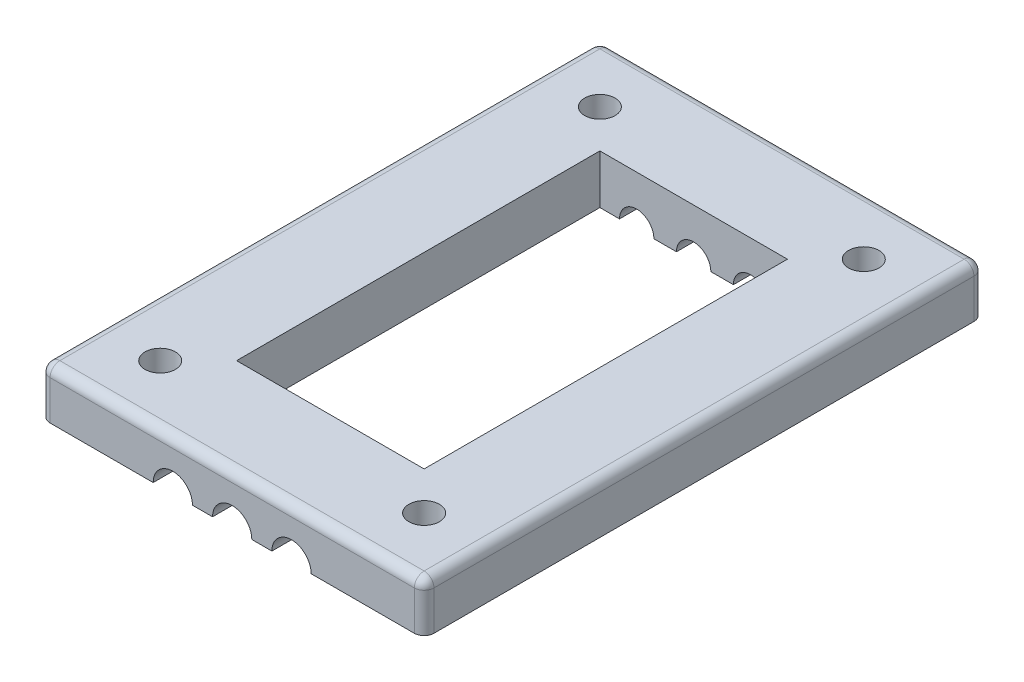
ISO-10303-21;
HEADER;
FILE_DESCRIPTION(('STEP AP214'),'2;1');
FILE_NAME('part.step','',(''),(''),'','','');
FILE_SCHEMA(('AUTOMOTIVE_DESIGN { 1 0 10303 214 1 1 1 1 }'));
ENDSEC;
DATA;
#1=APPLICATION_CONTEXT('core data for automotive mechanical design processes');
#2=APPLICATION_PROTOCOL_DEFINITION('international standard','automotive_design',2000,#1);
#3=PRODUCT_CONTEXT('',#1,'mechanical');
#4=PRODUCT('Part','Part','',(#3));
#5=PRODUCT_RELATED_PRODUCT_CATEGORY('part','',(#4));
#6=PRODUCT_DEFINITION_FORMATION('','',#4);
#7=PRODUCT_DEFINITION_CONTEXT('part definition',#1,'design');
#8=PRODUCT_DEFINITION('design','',#6,#7);
#9=PRODUCT_DEFINITION_SHAPE('','',#8);
#10=(LENGTH_UNIT() NAMED_UNIT(*) SI_UNIT(.MILLI.,.METRE.));
#11=(NAMED_UNIT(*) PLANE_ANGLE_UNIT() SI_UNIT($,.RADIAN.));
#12=(NAMED_UNIT(*) SI_UNIT($,.STERADIAN.) SOLID_ANGLE_UNIT());
#13=UNCERTAINTY_MEASURE_WITH_UNIT(LENGTH_MEASURE(1.E-05),#10,'distance_accuracy_value','');
#14=(GEOMETRIC_REPRESENTATION_CONTEXT(3) GLOBAL_UNCERTAINTY_ASSIGNED_CONTEXT((#13)) GLOBAL_UNIT_ASSIGNED_CONTEXT((#10,
#11,#12)) REPRESENTATION_CONTEXT('',''));
#15=CARTESIAN_POINT('',(0.,0.,0.));
#16=DIRECTION('',(0.,0.,1.));
#17=DIRECTION('',(1.,0.,0.));
#18=AXIS2_PLACEMENT_3D('',#15,#16,#17);
#19=CARTESIAN_POINT('',(19.55,20.1031353824411,-54.3715932879716));
#20=DIRECTION('',(0.,-1.,0.));
#21=DIRECTION('',(1.,0.,0.));
#22=AXIS2_PLACEMENT_3D('',#19,#20,#21);
#23=PLANE('',#22);
#24=DIRECTION('',(1.,0.,0.));
#25=VECTOR('',#24,1.);
#26=CARTESIAN_POINT('',(-9.55,20.1031353824411,-28.5));
#27=LINE('',#26,#25);
#28=CARTESIAN_POINT('',(-4.04999999999999,20.1031353824411,-28.5));
#29=VERTEX_POINT('',#28);
#30=CARTESIAN_POINT('',(-1.75,20.1031353824411,-28.5));
#31=VERTEX_POINT('',#30);
#32=EDGE_CURVE('E412',#29,#31,#27,.T.);
#33=ORIENTED_EDGE('',*,*,#32,.F.);
#34=DIRECTION('',(0.,0.,1.));
#35=VECTOR('',#34,1.);
#36=CARTESIAN_POINT('',(-4.04999999999999,20.1031353824411,-38.501));
#37=LINE('',#36,#35);
#38=CARTESIAN_POINT('',(-4.04999999999999,20.1031353824411,-38.5));
#39=VERTEX_POINT('',#38);
#40=EDGE_CURVE('E428',#29,#39,#37,.F.);
#41=ORIENTED_EDGE('',*,*,#40,.T.);
#42=DIRECTION('',(-1.,0.,0.));
#43=VECTOR('',#42,1.);
#44=CARTESIAN_POINT('',(0.,20.1031353824411,-38.5));
#45=LINE('',#44,#43);
#46=CARTESIAN_POINT('',(-1.75,20.1031353824411,-38.5));
#47=VERTEX_POINT('',#46);
#48=EDGE_CURVE('E504',#47,#39,#45,.T.);
#49=ORIENTED_EDGE('',*,*,#48,.F.);
#50=DIRECTION('',(0.,0.,1.));
#51=VECTOR('',#50,1.);
#52=CARTESIAN_POINT('',(-1.75,20.1031353824411,-38.501));
#53=LINE('',#52,#51);
#54=EDGE_CURVE('E437',#47,#31,#53,.T.);
#55=ORIENTED_EDGE('',*,*,#54,.T.);
#56=EDGE_LOOP('',(#33,#41,#49,#55));
#57=FACE_BOUND('',#56,.T.);
#58=ADVANCED_FACE('F41',(#57),#23,.T.);
#59=CARTESIAN_POINT('',(1.75000000000001,20.1031353824411,-28.5));
#60=VERTEX_POINT('',#59);
#61=CARTESIAN_POINT('',(4.05,20.1031353824411,-28.5));
#62=VERTEX_POINT('',#61);
#63=EDGE_CURVE('E515',#60,#62,#27,.T.);
#64=ORIENTED_EDGE('',*,*,#63,.F.);
#65=DIRECTION('',(0.,0.,1.));
#66=VECTOR('',#65,1.);
#67=CARTESIAN_POINT('',(1.75000000000001,20.1031353824411,-38.501));
#68=LINE('',#67,#66);
#69=CARTESIAN_POINT('',(1.75000000000001,20.1031353824411,-38.5));
#70=VERTEX_POINT('',#69);
#71=EDGE_CURVE('E434',#60,#70,#68,.F.);
#72=ORIENTED_EDGE('',*,*,#71,.T.);
#73=CARTESIAN_POINT('',(4.05,20.1031353824411,-38.5));
#74=VERTEX_POINT('',#73);
#75=EDGE_CURVE('E419',#74,#70,#45,.T.);
#76=ORIENTED_EDGE('',*,*,#75,.F.);
#77=DIRECTION('',(0.,0.,1.));
#78=VECTOR('',#77,1.);
#79=CARTESIAN_POINT('',(4.05,20.1031353824411,-38.501));
#80=LINE('',#79,#78);
#81=EDGE_CURVE('E443',#74,#62,#80,.T.);
#82=ORIENTED_EDGE('',*,*,#81,.T.);
#83=EDGE_LOOP('',(#64,#72,#76,#82));
#84=FACE_BOUND('',#83,.T.);
#85=ADVANCED_FACE('F513',(#84),#23,.T.);
#86=DIRECTION('',(-1.,0.,0.));
#87=VECTOR('',#86,1.);
#88=CARTESIAN_POINT('',(0.,20.1031353824411,18.5));
#89=LINE('',#88,#87);
#90=CARTESIAN_POINT('',(4.045,20.1031353824411,18.5));
#91=VERTEX_POINT('',#90);
#92=CARTESIAN_POINT('',(2.00000000000001,20.1031353824411,18.5));
#93=VERTEX_POINT('',#92);
#94=EDGE_CURVE('E458',#91,#93,#89,.T.);
#95=ORIENTED_EDGE('',*,*,#94,.T.);
#96=DIRECTION('',(0.,0.,-1.));
#97=VECTOR('',#96,1.);
#98=CARTESIAN_POINT('',(2.00000000000001,20.1031353824411,18.501));
#99=LINE('',#98,#97);
#100=CARTESIAN_POINT('',(2.00000000000001,20.1031353824411,8.5));
#101=VERTEX_POINT('',#100);
#102=EDGE_CURVE('E449',#93,#101,#99,.T.);
#103=ORIENTED_EDGE('',*,*,#102,.T.);
#104=DIRECTION('',(-1.,0.,0.));
#105=VECTOR('',#104,1.);
#106=CARTESIAN_POINT('',(-9.55,20.1031353824411,8.5));
#107=LINE('',#106,#105);
#108=CARTESIAN_POINT('',(4.045,20.1031353824411,8.5));
#109=VERTEX_POINT('',#108);
#110=EDGE_CURVE('E406',#109,#101,#107,.T.);
#111=ORIENTED_EDGE('',*,*,#110,.F.);
#112=DIRECTION('',(0.,0.,-1.));
#113=VECTOR('',#112,1.);
#114=CARTESIAN_POINT('',(4.045,20.1031353824411,18.501));
#115=LINE('',#114,#113);
#116=EDGE_CURVE('E249',#109,#91,#115,.F.);
#117=ORIENTED_EDGE('',*,*,#116,.T.);
#118=EDGE_LOOP('',(#95,#103,#111,#117));
#119=FACE_BOUND('',#118,.T.);
#120=ADVANCED_FACE('F456',(#119),#23,.T.);
#121=CARTESIAN_POINT('',(18.55,20.1031353824411,-38.5));
#122=VERTEX_POINT('',#121);
#123=CARTESIAN_POINT('',(7.55000000000001,20.1031353824411,-38.5));
#124=VERTEX_POINT('',#123);
#125=EDGE_CURVE('E417',#122,#124,#45,.T.);
#126=ORIENTED_EDGE('',*,*,#125,.F.);
#127=CARTESIAN_POINT('',(18.55,20.1031353824411,-37.5));
#128=DIRECTION('',(0.,-1.,0.));
#129=DIRECTION('',(1.,0.,0.));
#130=AXIS2_PLACEMENT_3D('',#127,#128,#129);
#131=CIRCLE('',#130,1.);
#132=CARTESIAN_POINT('',(19.55,20.1031353824411,-37.5));
#133=VERTEX_POINT('',#132);
#134=EDGE_CURVE('E64',#122,#133,#131,.T.);
#135=ORIENTED_EDGE('',*,*,#134,.T.);
#136=DIRECTION('',(0.,0.,-1.));
#137=VECTOR('',#136,1.);
#138=CARTESIAN_POINT('',(19.55,20.1031353824411,0.));
#139=LINE('',#138,#137);
#140=CARTESIAN_POINT('',(19.55,20.1031353824411,17.5));
#141=VERTEX_POINT('',#140);
#142=EDGE_CURVE('E420',#141,#133,#139,.T.);
#143=ORIENTED_EDGE('',*,*,#142,.F.);
#144=CARTESIAN_POINT('',(18.55,20.1031353824411,17.5));
#145=DIRECTION('',(0.,-1.,0.));
#146=DIRECTION('',(1.,0.,0.));
#147=AXIS2_PLACEMENT_3D('',#144,#145,#146);
#148=CIRCLE('',#147,1.);
#149=CARTESIAN_POINT('',(18.55,20.1031353824411,18.5));
#150=VERTEX_POINT('',#149);
#151=EDGE_CURVE('E58',#141,#150,#148,.T.);
#152=ORIENTED_EDGE('',*,*,#151,.T.);
#153=CARTESIAN_POINT('',(8.04500000000001,20.1031353824411,18.5));
#154=VERTEX_POINT('',#153);
#155=EDGE_CURVE('E424',#150,#154,#89,.T.);
#156=ORIENTED_EDGE('',*,*,#155,.T.);
#157=DIRECTION('',(0.,0.,-1.));
#158=VECTOR('',#157,1.);
#159=CARTESIAN_POINT('',(8.04500000000001,20.1031353824411,18.501));
#160=LINE('',#159,#158);
#161=CARTESIAN_POINT('',(8.04500000000001,20.1031353824411,8.5));
#162=VERTEX_POINT('',#161);
#163=EDGE_CURVE('E245',#154,#162,#160,.T.);
#164=ORIENTED_EDGE('',*,*,#163,.T.);
#165=CARTESIAN_POINT('',(9.55,20.1031353824411,8.5));
#166=VERTEX_POINT('',#165);
#167=EDGE_CURVE('E242',#166,#162,#107,.T.);
#168=ORIENTED_EDGE('',*,*,#167,.F.);
#169=DIRECTION('',(0.,0.,1.));
#170=VECTOR('',#169,1.);
#171=CARTESIAN_POINT('',(9.55,20.1031353824411,-28.5));
#172=LINE('',#171,#170);
#173=CARTESIAN_POINT('',(9.55,20.1031353824411,-28.5));
#174=VERTEX_POINT('',#173);
#175=EDGE_CURVE('E413',#174,#166,#172,.T.);
#176=ORIENTED_EDGE('',*,*,#175,.F.);
#177=CARTESIAN_POINT('',(7.55000000000001,20.1031353824411,-28.5));
#178=VERTEX_POINT('',#177);
#179=EDGE_CURVE('E408',#178,#174,#27,.T.);
#180=ORIENTED_EDGE('',*,*,#179,.F.);
#181=DIRECTION('',(0.,0.,1.));
#182=VECTOR('',#181,1.);
#183=CARTESIAN_POINT('',(7.55000000000001,20.1031353824411,-38.501));
#184=LINE('',#183,#182);
#185=EDGE_CURVE('E440',#178,#124,#184,.F.);
#186=ORIENTED_EDGE('',*,*,#185,.T.);
#187=EDGE_LOOP('',(#126,#135,#143,#152,#156,#164,#168,#176,#180,#186));
#188=FACE_BOUND('',#187,.T.);
#189=CARTESIAN_POINT('',(13.439087296526,20.1031353824411,-32.389087296526));
#190=DIRECTION('',(0.,-1.,0.));
#191=DIRECTION('',(1.,0.,0.));
#192=AXIS2_PLACEMENT_3D('',#189,#190,#191);
#193=CIRCLE('',#192,1.54999999999999);
#194=CARTESIAN_POINT('',(14.989087296526,20.1031353824411,-32.389087296526));
#195=VERTEX_POINT('',#194);
#196=EDGE_CURVE('E361',#195,#195,#193,.T.);
#197=ORIENTED_EDGE('',*,*,#196,.F.);
#198=EDGE_LOOP('',(#197));
#199=FACE_BOUND('',#198,.T.);
#200=CARTESIAN_POINT('',(13.439087296526,20.1031353824411,12.389087296526));
#201=DIRECTION('',(0.,-1.,0.));
#202=DIRECTION('',(1.,0.,0.));
#203=AXIS2_PLACEMENT_3D('',#200,#201,#202);
#204=CIRCLE('',#203,1.55);
#205=CARTESIAN_POINT('',(14.989087296526,20.1031353824411,12.389087296526));
#206=VERTEX_POINT('',#205);
#207=EDGE_CURVE('E400',#206,#206,#204,.T.);
#208=ORIENTED_EDGE('',*,*,#207,.F.);
#209=EDGE_LOOP('',(#208));
#210=FACE_BOUND('',#209,.T.);
#211=ADVANCED_FACE('F543',(#188,#199,#210),#23,.T.);
#212=DIRECTION('',(0.,0.,-1.));
#213=VECTOR('',#212,1.);
#214=CARTESIAN_POINT('',(-19.55,20.1031353824411,0.));
#215=LINE('',#214,#213);
#216=CARTESIAN_POINT('',(-19.55,20.1031353824411,17.5));
#217=VERTEX_POINT('',#216);
#218=CARTESIAN_POINT('',(-19.55,20.1031353824411,-37.5));
#219=VERTEX_POINT('',#218);
#220=EDGE_CURVE('E422',#217,#219,#215,.T.);
#221=ORIENTED_EDGE('',*,*,#220,.T.);
#222=CARTESIAN_POINT('',(-18.55,20.1031353824411,-37.5));
#223=DIRECTION('',(0.,-1.,0.));
#224=DIRECTION('',(1.,0.,0.));
#225=AXIS2_PLACEMENT_3D('',#222,#223,#224);
#226=CIRCLE('',#225,1.);
#227=CARTESIAN_POINT('',(-18.55,20.1031353824411,-38.5));
#228=VERTEX_POINT('',#227);
#229=EDGE_CURVE('E314',#219,#228,#226,.T.);
#230=ORIENTED_EDGE('',*,*,#229,.T.);
#231=CARTESIAN_POINT('',(-7.55,20.1031353824411,-38.5));
#232=VERTEX_POINT('',#231);
#233=EDGE_CURVE('E416',#232,#228,#45,.T.);
#234=ORIENTED_EDGE('',*,*,#233,.F.);
#235=DIRECTION('',(0.,0.,1.));
#236=VECTOR('',#235,1.);
#237=CARTESIAN_POINT('',(-7.55,20.1031353824411,-38.501));
#238=LINE('',#237,#236);
#239=CARTESIAN_POINT('',(-7.55,20.1031353824411,-28.5));
#240=VERTEX_POINT('',#239);
#241=EDGE_CURVE('E431',#232,#240,#238,.T.);
#242=ORIENTED_EDGE('',*,*,#241,.T.);
#243=CARTESIAN_POINT('',(-9.55,20.1031353824411,-28.5));
#244=VERTEX_POINT('',#243);
#245=EDGE_CURVE('E409',#244,#240,#27,.T.);
#246=ORIENTED_EDGE('',*,*,#245,.F.);
#247=DIRECTION('',(0.,0.,-1.));
#248=VECTOR('',#247,1.);
#249=CARTESIAN_POINT('',(-9.55,20.1031353824411,-28.5));
#250=LINE('',#249,#248);
#251=CARTESIAN_POINT('',(-9.55,20.1031353824411,8.5));
#252=VERTEX_POINT('',#251);
#253=EDGE_CURVE('E238',#252,#244,#250,.T.);
#254=ORIENTED_EDGE('',*,*,#253,.F.);
#255=CARTESIAN_POINT('',(-8.045,20.1031353824411,8.5));
#256=VERTEX_POINT('',#255);
#257=EDGE_CURVE('E219',#256,#252,#107,.T.);
#258=ORIENTED_EDGE('',*,*,#257,.F.);
#259=DIRECTION('',(0.,0.,-1.));
#260=VECTOR('',#259,1.);
#261=CARTESIAN_POINT('',(-8.045,20.1031353824411,18.501));
#262=LINE('',#261,#260);
#263=CARTESIAN_POINT('',(-8.045,20.1031353824411,18.5));
#264=VERTEX_POINT('',#263);
#265=EDGE_CURVE('E236',#256,#264,#262,.F.);
#266=ORIENTED_EDGE('',*,*,#265,.T.);
#267=CARTESIAN_POINT('',(-18.55,20.1031353824411,18.5));
#268=VERTEX_POINT('',#267);
#269=EDGE_CURVE('E425',#264,#268,#89,.T.);
#270=ORIENTED_EDGE('',*,*,#269,.T.);
#271=CARTESIAN_POINT('',(-18.55,20.1031353824411,17.5));
#272=DIRECTION('',(0.,-1.,0.));
#273=DIRECTION('',(1.,0.,0.));
#274=AXIS2_PLACEMENT_3D('',#271,#272,#273);
#275=CIRCLE('',#274,1.);
#276=EDGE_CURVE('E312',#268,#217,#275,.T.);
#277=ORIENTED_EDGE('',*,*,#276,.T.);
#278=EDGE_LOOP('',(#221,#230,#234,#242,#246,#254,#258,#266,#270,#277));
#279=FACE_BOUND('',#278,.T.);
#280=CARTESIAN_POINT('',(-13.439087296526,20.1031353824411,-32.389087296526));
#281=DIRECTION('',(0.,-1.,0.));
#282=DIRECTION('',(1.,0.,0.));
#283=AXIS2_PLACEMENT_3D('',#280,#281,#282);
#284=CIRCLE('',#283,1.54999999999999);
#285=CARTESIAN_POINT('',(-11.889087296526,20.1031353824411,-32.389087296526));
#286=VERTEX_POINT('',#285);
#287=EDGE_CURVE('E355',#286,#286,#284,.T.);
#288=ORIENTED_EDGE('',*,*,#287,.F.);
#289=EDGE_LOOP('',(#288));
#290=FACE_BOUND('',#289,.T.);
#291=CARTESIAN_POINT('',(-13.439087296526,20.1031353824411,12.389087296526));
#292=DIRECTION('',(0.,-1.,0.));
#293=DIRECTION('',(1.,0.,0.));
#294=AXIS2_PLACEMENT_3D('',#291,#292,#293);
#295=CIRCLE('',#294,1.55);
#296=CARTESIAN_POINT('',(-11.889087296526,20.1031353824411,12.389087296526));
#297=VERTEX_POINT('',#296);
#298=EDGE_CURVE('E240',#297,#297,#295,.T.);
#299=ORIENTED_EDGE('',*,*,#298,.F.);
#300=EDGE_LOOP('',(#299));
#301=FACE_BOUND('',#300,.T.);
#302=ADVANCED_FACE('F233',(#279,#290,#301),#23,.T.);
#303=CARTESIAN_POINT('',(-2.,20.1031353824411,8.5));
#304=VERTEX_POINT('',#303);
#305=CARTESIAN_POINT('',(-4.045,20.1031353824411,8.5));
#306=VERTEX_POINT('',#305);
#307=EDGE_CURVE('E222',#304,#306,#107,.T.);
#308=ORIENTED_EDGE('',*,*,#307,.F.);
#309=DIRECTION('',(0.,0.,-1.));
#310=VECTOR('',#309,1.);
#311=CARTESIAN_POINT('',(-2.,20.1031353824411,18.501));
#312=LINE('',#311,#310);
#313=CARTESIAN_POINT('',(-2.,20.1031353824411,18.5));
#314=VERTEX_POINT('',#313);
#315=EDGE_CURVE('E446',#304,#314,#312,.F.);
#316=ORIENTED_EDGE('',*,*,#315,.T.);
#317=CARTESIAN_POINT('',(-4.045,20.1031353824411,18.5));
#318=VERTEX_POINT('',#317);
#319=EDGE_CURVE('E427',#314,#318,#89,.T.);
#320=ORIENTED_EDGE('',*,*,#319,.T.);
#321=DIRECTION('',(0.,0.,-1.));
#322=VECTOR('',#321,1.);
#323=CARTESIAN_POINT('',(-4.045,20.1031353824411,18.501));
#324=LINE('',#323,#322);
#325=EDGE_CURVE('E246',#318,#306,#324,.T.);
#326=ORIENTED_EDGE('',*,*,#325,.T.);
#327=EDGE_LOOP('',(#308,#316,#320,#326));
#328=FACE_BOUND('',#327,.T.);
#329=ADVANCED_FACE('F470',(#328),#23,.T.);
#330=CARTESIAN_POINT('',(-18.55,24.1031353824411,0.));
#331=DIRECTION('',(0.,0.,-1.));
#332=DIRECTION('',(-1.,0.,0.));
#333=AXIS2_PLACEMENT_3D('',#330,#331,#332);
#334=CYLINDRICAL_SURFACE('',#333,1.);
#335=DIRECTION('',(0.,0.,1.));
#336=VECTOR('',#335,1.);
#337=CARTESIAN_POINT('',(-18.55,25.1031353824411,18.5));
#338=LINE('',#337,#336);
#339=CARTESIAN_POINT('',(-18.55,25.1031353824411,-37.5));
#340=VERTEX_POINT('',#339);
#341=CARTESIAN_POINT('',(-18.55,25.1031353824411,17.5));
#342=VERTEX_POINT('',#341);
#343=EDGE_CURVE('E372',#340,#342,#338,.T.);
#344=ORIENTED_EDGE('',*,*,#343,.F.);
#345=CARTESIAN_POINT('',(-18.55,24.1031353824411,-37.5));
#346=DIRECTION('',(0.,0.,-1.));
#347=DIRECTION('',(-1.,0.,0.));
#348=AXIS2_PLACEMENT_3D('',#345,#346,#347);
#349=CIRCLE('',#348,1.);
#350=CARTESIAN_POINT('',(-19.55,24.1031353824411,-37.5));
#351=VERTEX_POINT('',#350);
#352=EDGE_CURVE('E297',#340,#351,#349,.F.);
#353=ORIENTED_EDGE('',*,*,#352,.T.);
#354=DIRECTION('',(0.,0.,1.));
#355=VECTOR('',#354,1.);
#356=CARTESIAN_POINT('',(-19.55,24.1031353824411,-38.5));
#357=LINE('',#356,#355);
#358=CARTESIAN_POINT('',(-19.55,24.1031353824411,17.5));
#359=VERTEX_POINT('',#358);
#360=EDGE_CURVE('E358',#359,#351,#357,.F.);
#361=ORIENTED_EDGE('',*,*,#360,.F.);
#362=CARTESIAN_POINT('',(-18.55,24.1031353824411,17.5));
#363=DIRECTION('',(0.,0.,-1.));
#364=DIRECTION('',(-1.,0.,0.));
#365=AXIS2_PLACEMENT_3D('',#362,#363,#364);
#366=CIRCLE('',#365,1.);
#367=EDGE_CURVE('E294',#359,#342,#366,.T.);
#368=ORIENTED_EDGE('',*,*,#367,.T.);
#369=EDGE_LOOP('',(#344,#353,#361,#368));
#370=FACE_BOUND('',#369,.T.);
#371=ADVANCED_FACE('F484',(#370),#334,.T.);
#372=CARTESIAN_POINT('',(0.,15.1031353824411,-38.5));
#373=DIRECTION('',(0.,0.,-1.));
#374=DIRECTION('',(-1.,0.,0.));
#375=AXIS2_PLACEMENT_3D('',#372,#373,#374);
#376=PLANE('',#375);
#377=ORIENTED_EDGE('',*,*,#233,.T.);
#378=DIRECTION('',(0.,-1.,0.));
#379=VECTOR('',#378,1.);
#380=CARTESIAN_POINT('',(-18.55,24.1031353824411,-38.5));
#381=LINE('',#380,#379);
#382=CARTESIAN_POINT('',(-18.55,24.1031353824411,-38.5));
#383=VERTEX_POINT('',#382);
#384=EDGE_CURVE('E318',#228,#383,#381,.F.);
#385=ORIENTED_EDGE('',*,*,#384,.T.);
#386=DIRECTION('',(-1.,0.,0.));
#387=VECTOR('',#386,1.);
#388=CARTESIAN_POINT('',(0.,24.1031353824411,-38.5));
#389=LINE('',#388,#387);
#390=CARTESIAN_POINT('',(18.55,24.1031353824411,-38.5));
#391=VERTEX_POINT('',#390);
#392=EDGE_CURVE('E366',#383,#391,#389,.F.);
#393=ORIENTED_EDGE('',*,*,#392,.T.);
#394=DIRECTION('',(0.,-1.,0.));
#395=VECTOR('',#394,1.);
#396=CARTESIAN_POINT('',(18.55,15.1031353824411,-38.5));
#397=LINE('',#396,#395);
#398=EDGE_CURVE('E316',#391,#122,#397,.T.);
#399=ORIENTED_EDGE('',*,*,#398,.T.);
#400=ORIENTED_EDGE('',*,*,#125,.T.);
#401=CARTESIAN_POINT('',(5.8,20.1031353824411,-38.5));
#402=DIRECTION('',(0.,0.,-1.));
#403=DIRECTION('',(-1.,0.,0.));
#404=AXIS2_PLACEMENT_3D('',#401,#402,#403);
#405=CIRCLE('',#404,1.75);
#406=EDGE_CURVE('E269',#124,#74,#405,.F.);
#407=ORIENTED_EDGE('',*,*,#406,.T.);
#408=ORIENTED_EDGE('',*,*,#75,.T.);
#409=CARTESIAN_POINT('',(0.,20.1031353824411,-38.5));
#410=DIRECTION('',(0.,0.,-1.));
#411=DIRECTION('',(-1.,0.,0.));
#412=AXIS2_PLACEMENT_3D('',#409,#410,#411);
#413=CIRCLE('',#412,1.75);
#414=EDGE_CURVE('E272',#70,#47,#413,.F.);
#415=ORIENTED_EDGE('',*,*,#414,.T.);
#416=ORIENTED_EDGE('',*,*,#48,.T.);
#417=CARTESIAN_POINT('',(-5.8,20.1031353824411,-38.5));
#418=DIRECTION('',(0.,0.,-1.));
#419=DIRECTION('',(-1.,0.,0.));
#420=AXIS2_PLACEMENT_3D('',#417,#418,#419);
#421=CIRCLE('',#420,1.75);
#422=EDGE_CURVE('E276',#39,#232,#421,.F.);
#423=ORIENTED_EDGE('',*,*,#422,.T.);
#424=EDGE_LOOP('',(#377,#385,#393,#399,#400,#407,#408,#415,#416,#423));
#425=FACE_BOUND('',#424,.T.);
#426=ADVANCED_FACE('F502',(#425),#376,.T.);
#427=CARTESIAN_POINT('',(0.,24.1031353824411,-37.5));
#428=DIRECTION('',(-1.,0.,0.));
#429=DIRECTION('',(0.,0.,1.));
#430=AXIS2_PLACEMENT_3D('',#427,#428,#429);
#431=CYLINDRICAL_SURFACE('',#430,1.);
#432=ORIENTED_EDGE('',*,*,#392,.F.);
#433=CARTESIAN_POINT('',(-18.55,24.1031353824411,-37.5));
#434=DIRECTION('',(-1.,0.,0.));
#435=DIRECTION('',(0.,0.,1.));
#436=AXIS2_PLACEMENT_3D('',#433,#434,#435);
#437=CIRCLE('',#436,1.);
#438=EDGE_CURVE('E291',#383,#340,#437,.F.);
#439=ORIENTED_EDGE('',*,*,#438,.T.);
#440=DIRECTION('',(-1.,0.,0.));
#441=VECTOR('',#440,1.);
#442=CARTESIAN_POINT('',(0.,25.1031353824411,-37.5));
#443=LINE('',#442,#441);
#444=CARTESIAN_POINT('',(18.55,25.1031353824411,-37.5));
#445=VERTEX_POINT('',#444);
#446=EDGE_CURVE('E369',#445,#340,#443,.T.);
#447=ORIENTED_EDGE('',*,*,#446,.F.);
#448=CARTESIAN_POINT('',(18.55,24.1031353824411,-37.5));
#449=DIRECTION('',(-1.,0.,0.));
#450=DIRECTION('',(0.,0.,1.));
#451=AXIS2_PLACEMENT_3D('',#448,#449,#450);
#452=CIRCLE('',#451,1.);
#453=EDGE_CURVE('E288',#445,#391,#452,.T.);
#454=ORIENTED_EDGE('',*,*,#453,.T.);
#455=EDGE_LOOP('',(#432,#439,#447,#454));
#456=FACE_BOUND('',#455,.T.);
#457=ADVANCED_FACE('F492',(#456),#431,.T.);
#458=CARTESIAN_POINT('',(-9.55,25.1031353824411,-28.5));
#459=DIRECTION('',(0.,0.,1.));
#460=DIRECTION('',(1.,0.,0.));
#461=AXIS2_PLACEMENT_3D('',#458,#459,#460);
#462=PLANE('',#461);
#463=DIRECTION('',(0.,-1.,0.));
#464=VECTOR('',#463,1.);
#465=CARTESIAN_POINT('',(-9.55,25.1031353824411,-28.5));
#466=LINE('',#465,#464);
#467=CARTESIAN_POINT('',(-9.55,25.1031353824411,-28.5));
#468=VERTEX_POINT('',#467);
#469=EDGE_CURVE('E258',#468,#244,#466,.T.);
#470=ORIENTED_EDGE('',*,*,#469,.T.);
#471=ORIENTED_EDGE('',*,*,#245,.T.);
#472=CARTESIAN_POINT('',(-5.8,20.1031353824411,-28.5));
#473=DIRECTION('',(0.,0.,1.));
#474=DIRECTION('',(1.,0.,0.));
#475=AXIS2_PLACEMENT_3D('',#472,#473,#474);
#476=CIRCLE('',#475,1.75);
#477=EDGE_CURVE('E278',#29,#240,#476,.T.);
#478=ORIENTED_EDGE('',*,*,#477,.F.);
#479=ORIENTED_EDGE('',*,*,#32,.T.);
#480=CARTESIAN_POINT('',(0.,20.1031353824411,-28.5));
#481=DIRECTION('',(0.,0.,1.));
#482=DIRECTION('',(1.,0.,0.));
#483=AXIS2_PLACEMENT_3D('',#480,#481,#482);
#484=CIRCLE('',#483,1.75);
#485=EDGE_CURVE('E274',#60,#31,#484,.T.);
#486=ORIENTED_EDGE('',*,*,#485,.F.);
#487=ORIENTED_EDGE('',*,*,#63,.T.);
#488=CARTESIAN_POINT('',(5.8,20.1031353824411,-28.5));
#489=DIRECTION('',(0.,0.,1.));
#490=DIRECTION('',(1.,0.,0.));
#491=AXIS2_PLACEMENT_3D('',#488,#489,#490);
#492=CIRCLE('',#491,1.75);
#493=EDGE_CURVE('E267',#178,#62,#492,.T.);
#494=ORIENTED_EDGE('',*,*,#493,.F.);
#495=ORIENTED_EDGE('',*,*,#179,.T.);
#496=DIRECTION('',(0.,-1.,0.));
#497=VECTOR('',#496,1.);
#498=CARTESIAN_POINT('',(9.55,25.1031353824411,-28.5));
#499=LINE('',#498,#497);
#500=CARTESIAN_POINT('',(9.55,25.1031353824411,-28.5));
#501=VERTEX_POINT('',#500);
#502=EDGE_CURVE('E255',#501,#174,#499,.T.);
#503=ORIENTED_EDGE('',*,*,#502,.F.);
#504=DIRECTION('',(-1.,0.,0.));
#505=VECTOR('',#504,1.);
#506=CARTESIAN_POINT('',(-9.55,25.1031353824411,-28.5));
#507=LINE('',#506,#505);
#508=EDGE_CURVE('E383',#501,#468,#507,.T.);
#509=ORIENTED_EDGE('',*,*,#508,.T.);
#510=EDGE_LOOP('',(#470,#471,#478,#479,#486,#487,#494,#495,#503,#509));
#511=FACE_BOUND('',#510,.T.);
#512=ADVANCED_FACE('F527',(#511),#462,.T.);
#513=CARTESIAN_POINT('',(5.8,20.1031353824411,-38.501));
#514=DIRECTION('',(0.,0.,1.));
#515=DIRECTION('',(1.,0.,0.));
#516=AXIS2_PLACEMENT_3D('',#513,#514,#515);
#517=CYLINDRICAL_SURFACE('',#516,1.75);
#518=ORIENTED_EDGE('',*,*,#185,.F.);
#519=ORIENTED_EDGE('',*,*,#493,.T.);
#520=ORIENTED_EDGE('',*,*,#81,.F.);
#521=ORIENTED_EDGE('',*,*,#406,.F.);
#522=EDGE_LOOP('',(#518,#519,#520,#521));
#523=FACE_BOUND('',#522,.T.);
#524=ADVANCED_FACE('F792',(#523),#517,.F.);
#525=CARTESIAN_POINT('',(0.,20.1031353824411,-38.501));
#526=DIRECTION('',(0.,0.,1.));
#527=DIRECTION('',(1.,0.,0.));
#528=AXIS2_PLACEMENT_3D('',#525,#526,#527);
#529=CYLINDRICAL_SURFACE('',#528,1.75);
#530=ORIENTED_EDGE('',*,*,#71,.F.);
#531=ORIENTED_EDGE('',*,*,#485,.T.);
#532=ORIENTED_EDGE('',*,*,#54,.F.);
#533=ORIENTED_EDGE('',*,*,#414,.F.);
#534=EDGE_LOOP('',(#530,#531,#532,#533));
#535=FACE_BOUND('',#534,.T.);
#536=ADVANCED_FACE('F517',(#535),#529,.F.);
#537=CARTESIAN_POINT('',(-5.8,20.1031353824411,-38.501));
#538=DIRECTION('',(0.,0.,1.));
#539=DIRECTION('',(1.,0.,0.));
#540=AXIS2_PLACEMENT_3D('',#537,#538,#539);
#541=CYLINDRICAL_SURFACE('',#540,1.75);
#542=ORIENTED_EDGE('',*,*,#40,.F.);
#543=ORIENTED_EDGE('',*,*,#477,.T.);
#544=ORIENTED_EDGE('',*,*,#241,.F.);
#545=ORIENTED_EDGE('',*,*,#422,.F.);
#546=EDGE_LOOP('',(#542,#543,#544,#545));
#547=FACE_BOUND('',#546,.T.);
#548=ADVANCED_FACE('F524',(#547),#541,.F.);
#549=CARTESIAN_POINT('',(-9.55,25.1031353824411,-28.5));
#550=DIRECTION('',(1.,0.,0.));
#551=DIRECTION('',(0.,0.,-1.));
#552=AXIS2_PLACEMENT_3D('',#549,#550,#551);
#553=PLANE('',#552);
#554=DIRECTION('',(0.,-1.,0.));
#555=VECTOR('',#554,1.);
#556=CARTESIAN_POINT('',(-9.55,25.1031353824411,8.5));
#557=LINE('',#556,#555);
#558=CARTESIAN_POINT('',(-9.55,25.1031353824411,8.5));
#559=VERTEX_POINT('',#558);
#560=EDGE_CURVE('E262',#559,#252,#557,.T.);
#561=ORIENTED_EDGE('',*,*,#560,.T.);
#562=ORIENTED_EDGE('',*,*,#253,.T.);
#563=ORIENTED_EDGE('',*,*,#469,.F.);
#564=DIRECTION('',(0.,0.,1.));
#565=VECTOR('',#564,1.);
#566=CARTESIAN_POINT('',(-9.55,25.1031353824411,-28.5));
#567=LINE('',#566,#565);
#568=EDGE_CURVE('E380',#468,#559,#567,.T.);
#569=ORIENTED_EDGE('',*,*,#568,.T.);
#570=EDGE_LOOP('',(#561,#562,#563,#569));
#571=FACE_BOUND('',#570,.T.);
#572=ADVANCED_FACE('F532',(#571),#553,.T.);
#573=CARTESIAN_POINT('',(9.55,25.1031353824411,-28.5));
#574=DIRECTION('',(-1.,0.,0.));
#575=DIRECTION('',(0.,0.,1.));
#576=AXIS2_PLACEMENT_3D('',#573,#574,#575);
#577=PLANE('',#576);
#578=ORIENTED_EDGE('',*,*,#502,.T.);
#579=ORIENTED_EDGE('',*,*,#175,.T.);
#580=DIRECTION('',(0.,-1.,0.));
#581=VECTOR('',#580,1.);
#582=CARTESIAN_POINT('',(9.55,25.1031353824411,8.5));
#583=LINE('',#582,#581);
#584=CARTESIAN_POINT('',(9.55,25.1031353824411,8.5));
#585=VERTEX_POINT('',#584);
#586=EDGE_CURVE('E264',#585,#166,#583,.T.);
#587=ORIENTED_EDGE('',*,*,#586,.F.);
#588=DIRECTION('',(0.,0.,-1.));
#589=VECTOR('',#588,1.);
#590=CARTESIAN_POINT('',(9.55,25.1031353824411,-28.5));
#591=LINE('',#590,#589);
#592=EDGE_CURVE('E385',#585,#501,#591,.T.);
#593=ORIENTED_EDGE('',*,*,#592,.T.);
#594=EDGE_LOOP('',(#578,#579,#587,#593));
#595=FACE_BOUND('',#594,.T.);
#596=ADVANCED_FACE('F540',(#595),#577,.T.);
#597=CARTESIAN_POINT('',(0.,15.1031353824411,18.5));
#598=DIRECTION('',(0.,0.,-1.));
#599=DIRECTION('',(-1.,0.,0.));
#600=AXIS2_PLACEMENT_3D('',#597,#598,#599);
#601=PLANE('',#600);
#602=DIRECTION('',(1.,0.,0.));
#603=VECTOR('',#602,1.);
#604=CARTESIAN_POINT('',(-19.55,24.1031353824411,18.5));
#605=LINE('',#604,#603);
#606=CARTESIAN_POINT('',(18.55,24.1031353824411,18.5));
#607=VERTEX_POINT('',#606);
#608=CARTESIAN_POINT('',(-18.55,24.1031353824411,18.5));
#609=VERTEX_POINT('',#608);
#610=EDGE_CURVE('E354',#607,#609,#605,.F.);
#611=ORIENTED_EDGE('',*,*,#610,.T.);
#612=DIRECTION('',(0.,-1.,0.));
#613=VECTOR('',#612,1.);
#614=CARTESIAN_POINT('',(-18.55,15.1031353824411,18.5));
#615=LINE('',#614,#613);
#616=EDGE_CURVE('E11',#609,#268,#615,.T.);
#617=ORIENTED_EDGE('',*,*,#616,.T.);
#618=ORIENTED_EDGE('',*,*,#269,.F.);
#619=CARTESIAN_POINT('',(-6.045,20.1031353824411,18.5));
#620=DIRECTION('',(0.,0.,-1.));
#621=DIRECTION('',(-1.,0.,0.));
#622=AXIS2_PLACEMENT_3D('',#619,#620,#621);
#623=CIRCLE('',#622,2.);
#624=EDGE_CURVE('E228',#318,#264,#623,.F.);
#625=ORIENTED_EDGE('',*,*,#624,.F.);
#626=ORIENTED_EDGE('',*,*,#319,.F.);
#627=CARTESIAN_POINT('',(0.,20.1031353824411,18.5));
#628=DIRECTION('',(0.,0.,-1.));
#629=DIRECTION('',(-1.,0.,0.));
#630=AXIS2_PLACEMENT_3D('',#627,#628,#629);
#631=CIRCLE('',#630,2.00000000000001);
#632=EDGE_CURVE('E286',#93,#314,#631,.F.);
#633=ORIENTED_EDGE('',*,*,#632,.F.);
#634=ORIENTED_EDGE('',*,*,#94,.F.);
#635=CARTESIAN_POINT('',(6.045,20.1031353824411,18.5));
#636=DIRECTION('',(0.,0.,-1.));
#637=DIRECTION('',(-1.,0.,0.));
#638=AXIS2_PLACEMENT_3D('',#635,#636,#637);
#639=CIRCLE('',#638,2.00000000000001);
#640=EDGE_CURVE('E282',#154,#91,#639,.F.);
#641=ORIENTED_EDGE('',*,*,#640,.F.);
#642=ORIENTED_EDGE('',*,*,#155,.F.);
#643=DIRECTION('',(0.,-1.,0.));
#644=VECTOR('',#643,1.);
#645=CARTESIAN_POINT('',(18.55,24.1031353824411,18.5));
#646=LINE('',#645,#644);
#647=EDGE_CURVE('E50',#150,#607,#646,.F.);
#648=ORIENTED_EDGE('',*,*,#647,.T.);
#649=EDGE_LOOP('',(#611,#617,#618,#625,#626,#633,#634,#641,#642,#648));
#650=FACE_BOUND('',#649,.T.);
#651=ADVANCED_FACE('F466',(#650),#601,.F.);
#652=CARTESIAN_POINT('',(0.,24.1031353824411,17.5));
#653=DIRECTION('',(-1.,0.,0.));
#654=DIRECTION('',(0.,0.,1.));
#655=AXIS2_PLACEMENT_3D('',#652,#653,#654);
#656=CYLINDRICAL_SURFACE('',#655,1.);
#657=DIRECTION('',(1.,0.,0.));
#658=VECTOR('',#657,1.);
#659=CARTESIAN_POINT('',(19.55,25.1031353824411,17.5));
#660=LINE('',#659,#658);
#661=CARTESIAN_POINT('',(18.55,25.1031353824411,17.5));
#662=VERTEX_POINT('',#661);
#663=EDGE_CURVE('E375',#342,#662,#660,.T.);
#664=ORIENTED_EDGE('',*,*,#663,.F.);
#665=CARTESIAN_POINT('',(-18.55,24.1031353824411,17.5));
#666=DIRECTION('',(-1.,0.,0.));
#667=DIRECTION('',(0.,0.,1.));
#668=AXIS2_PLACEMENT_3D('',#665,#666,#667);
#669=CIRCLE('',#668,1.);
#670=EDGE_CURVE('E306',#342,#609,#669,.F.);
#671=ORIENTED_EDGE('',*,*,#670,.T.);
#672=ORIENTED_EDGE('',*,*,#610,.F.);
#673=CARTESIAN_POINT('',(18.55,24.1031353824411,17.5));
#674=DIRECTION('',(-1.,0.,0.));
#675=DIRECTION('',(0.,0.,1.));
#676=AXIS2_PLACEMENT_3D('',#673,#674,#675);
#677=CIRCLE('',#676,1.);
#678=EDGE_CURVE('E304',#607,#662,#677,.T.);
#679=ORIENTED_EDGE('',*,*,#678,.T.);
#680=EDGE_LOOP('',(#664,#671,#672,#679));
#681=FACE_BOUND('',#680,.T.);
#682=ADVANCED_FACE('F660',(#681),#656,.T.);
#683=CARTESIAN_POINT('',(-9.55,25.1031353824411,8.5));
#684=DIRECTION('',(0.,0.,-1.));
#685=DIRECTION('',(-1.,0.,0.));
#686=AXIS2_PLACEMENT_3D('',#683,#684,#685);
#687=PLANE('',#686);
#688=ORIENTED_EDGE('',*,*,#586,.T.);
#689=ORIENTED_EDGE('',*,*,#167,.T.);
#690=CARTESIAN_POINT('',(6.045,20.1031353824411,8.5));
#691=DIRECTION('',(0.,0.,-1.));
#692=DIRECTION('',(-1.,0.,0.));
#693=AXIS2_PLACEMENT_3D('',#690,#691,#692);
#694=CIRCLE('',#693,2.00000000000001);
#695=EDGE_CURVE('E227',#109,#162,#694,.T.);
#696=ORIENTED_EDGE('',*,*,#695,.F.);
#697=ORIENTED_EDGE('',*,*,#110,.T.);
#698=CARTESIAN_POINT('',(0.,20.1031353824411,8.5));
#699=DIRECTION('',(0.,0.,-1.));
#700=DIRECTION('',(-1.,0.,0.));
#701=AXIS2_PLACEMENT_3D('',#698,#699,#700);
#702=CIRCLE('',#701,2.00000000000001);
#703=EDGE_CURVE('E284',#304,#101,#702,.T.);
#704=ORIENTED_EDGE('',*,*,#703,.F.);
#705=ORIENTED_EDGE('',*,*,#307,.T.);
#706=CARTESIAN_POINT('',(-6.045,20.1031353824411,8.5));
#707=DIRECTION('',(0.,0.,-1.));
#708=DIRECTION('',(-1.,0.,0.));
#709=AXIS2_PLACEMENT_3D('',#706,#707,#708);
#710=CIRCLE('',#709,2.);
#711=EDGE_CURVE('E215',#256,#306,#710,.T.);
#712=ORIENTED_EDGE('',*,*,#711,.F.);
#713=ORIENTED_EDGE('',*,*,#257,.T.);
#714=ORIENTED_EDGE('',*,*,#560,.F.);
#715=DIRECTION('',(1.,0.,0.));
#716=VECTOR('',#715,1.);
#717=CARTESIAN_POINT('',(-9.55,25.1031353824411,8.5));
#718=LINE('',#717,#716);
#719=EDGE_CURVE('E266',#559,#585,#718,.T.);
#720=ORIENTED_EDGE('',*,*,#719,.T.);
#721=EDGE_LOOP('',(#688,#689,#696,#697,#704,#705,#712,#713,#714,#720));
#722=FACE_BOUND('',#721,.T.);
#723=ADVANCED_FACE('F218',(#722),#687,.T.);
#724=CARTESIAN_POINT('',(-6.045,20.1031353824411,18.501));
#725=DIRECTION('',(0.,0.,-1.));
#726=DIRECTION('',(-1.,0.,0.));
#727=AXIS2_PLACEMENT_3D('',#724,#725,#726);
#728=CYLINDRICAL_SURFACE('',#727,2.);
#729=ORIENTED_EDGE('',*,*,#265,.F.);
#730=ORIENTED_EDGE('',*,*,#711,.T.);
#731=ORIENTED_EDGE('',*,*,#325,.F.);
#732=ORIENTED_EDGE('',*,*,#624,.T.);
#733=EDGE_LOOP('',(#729,#730,#731,#732));
#734=FACE_BOUND('',#733,.T.);
#735=ADVANCED_FACE('F243',(#734),#728,.F.);
#736=CARTESIAN_POINT('',(6.045,20.1031353824411,18.501));
#737=DIRECTION('',(0.,0.,-1.));
#738=DIRECTION('',(-1.,0.,0.));
#739=AXIS2_PLACEMENT_3D('',#736,#737,#738);
#740=CYLINDRICAL_SURFACE('',#739,2.00000000000001);
#741=ORIENTED_EDGE('',*,*,#116,.F.);
#742=ORIENTED_EDGE('',*,*,#695,.T.);
#743=ORIENTED_EDGE('',*,*,#163,.F.);
#744=ORIENTED_EDGE('',*,*,#640,.T.);
#745=EDGE_LOOP('',(#741,#742,#743,#744));
#746=FACE_BOUND('',#745,.T.);
#747=ADVANCED_FACE('F462',(#746),#740,.F.);
#748=CARTESIAN_POINT('',(0.,20.1031353824411,18.501));
#749=DIRECTION('',(0.,0.,-1.));
#750=DIRECTION('',(-1.,0.,0.));
#751=AXIS2_PLACEMENT_3D('',#748,#749,#750);
#752=CYLINDRICAL_SURFACE('',#751,2.00000000000001);
#753=ORIENTED_EDGE('',*,*,#315,.F.);
#754=ORIENTED_EDGE('',*,*,#703,.T.);
#755=ORIENTED_EDGE('',*,*,#102,.F.);
#756=ORIENTED_EDGE('',*,*,#632,.T.);
#757=EDGE_LOOP('',(#753,#754,#755,#756));
#758=FACE_BOUND('',#757,.T.);
#759=ADVANCED_FACE('F547',(#758),#752,.F.);
#760=CARTESIAN_POINT('',(0.,25.1031353824411,0.));
#761=DIRECTION('',(0.,1.,0.));
#762=DIRECTION('',(0.,0.,1.));
#763=AXIS2_PLACEMENT_3D('',#760,#761,#762);
#764=PLANE('',#763);
#765=DIRECTION('',(0.,0.,-1.));
#766=VECTOR('',#765,1.);
#767=CARTESIAN_POINT('',(18.55,25.1031353824411,0.));
#768=LINE('',#767,#766);
#769=EDGE_CURVE('E259',#662,#445,#768,.T.);
#770=ORIENTED_EDGE('',*,*,#769,.T.);
#771=ORIENTED_EDGE('',*,*,#446,.T.);
#772=ORIENTED_EDGE('',*,*,#343,.T.);
#773=ORIENTED_EDGE('',*,*,#663,.T.);
#774=EDGE_LOOP('',(#770,#771,#772,#773));
#775=FACE_BOUND('',#774,.T.);
#776=CARTESIAN_POINT('',(13.439087296526,25.1031353824411,-32.389087296526));
#777=DIRECTION('',(0.,1.,0.));
#778=DIRECTION('',(0.,0.,1.));
#779=AXIS2_PLACEMENT_3D('',#776,#777,#778);
#780=CIRCLE('',#779,1.54999999999999);
#781=CARTESIAN_POINT('',(13.439087296526,25.1031353824411,-30.839087296526));
#782=VERTEX_POINT('',#781);
#783=EDGE_CURVE('E393',#782,#782,#780,.T.);
#784=ORIENTED_EDGE('',*,*,#783,.F.);
#785=EDGE_LOOP('',(#784));
#786=FACE_BOUND('',#785,.T.);
#787=CARTESIAN_POINT('',(-13.439087296526,25.1031353824411,12.389087296526));
#788=DIRECTION('',(0.,1.,0.));
#789=DIRECTION('',(0.,0.,1.));
#790=AXIS2_PLACEMENT_3D('',#787,#788,#789);
#791=CIRCLE('',#790,1.55);
#792=CARTESIAN_POINT('',(-13.439087296526,25.1031353824411,13.939087296526));
#793=VERTEX_POINT('',#792);
#794=EDGE_CURVE('E387',#793,#793,#791,.T.);
#795=ORIENTED_EDGE('',*,*,#794,.F.);
#796=EDGE_LOOP('',(#795));
#797=FACE_BOUND('',#796,.T.);
#798=ORIENTED_EDGE('',*,*,#508,.F.);
#799=ORIENTED_EDGE('',*,*,#592,.F.);
#800=ORIENTED_EDGE('',*,*,#719,.F.);
#801=ORIENTED_EDGE('',*,*,#568,.F.);
#802=EDGE_LOOP('',(#798,#799,#800,#801));
#803=FACE_BOUND('',#802,.T.);
#804=CARTESIAN_POINT('',(13.439087296526,25.1031353824411,12.389087296526));
#805=DIRECTION('',(0.,1.,0.));
#806=DIRECTION('',(0.,0.,-1.));
#807=AXIS2_PLACEMENT_3D('',#804,#805,#806);
#808=CIRCLE('',#807,1.55);
#809=CARTESIAN_POINT('',(13.439087296526,25.1031353824411,10.839087296526));
#810=VERTEX_POINT('',#809);
#811=EDGE_CURVE('E390',#810,#810,#808,.T.);
#812=ORIENTED_EDGE('',*,*,#811,.F.);
#813=EDGE_LOOP('',(#812));
#814=FACE_BOUND('',#813,.T.);
#815=CARTESIAN_POINT('',(-13.439087296526,25.1031353824411,-32.389087296526));
#816=DIRECTION('',(0.,1.,0.));
#817=DIRECTION('',(0.,0.,-1.));
#818=AXIS2_PLACEMENT_3D('',#815,#816,#817);
#819=CIRCLE('',#818,1.54999999999999);
#820=CARTESIAN_POINT('',(-13.439087296526,25.1031353824411,-33.939087296526));
#821=VERTEX_POINT('',#820);
#822=EDGE_CURVE('E270',#821,#821,#819,.T.);
#823=ORIENTED_EDGE('',*,*,#822,.F.);
#824=EDGE_LOOP('',(#823));
#825=FACE_BOUND('',#824,.T.);
#826=ADVANCED_FACE('F535',(#775,#786,#797,#803,#814,#825),#764,.T.);
#827=CARTESIAN_POINT('',(18.55,24.1031353824411,0.));
#828=DIRECTION('',(0.,0.,-1.));
#829=DIRECTION('',(-1.,0.,0.));
#830=AXIS2_PLACEMENT_3D('',#827,#828,#829);
#831=CYLINDRICAL_SURFACE('',#830,1.);
#832=DIRECTION('',(0.,0.,-1.));
#833=VECTOR('',#832,1.);
#834=CARTESIAN_POINT('',(19.55,24.1031353824411,0.));
#835=LINE('',#834,#833);
#836=CARTESIAN_POINT('',(19.55,24.1031353824411,-37.5));
#837=VERTEX_POINT('',#836);
#838=CARTESIAN_POINT('',(19.55,24.1031353824411,17.5));
#839=VERTEX_POINT('',#838);
#840=EDGE_CURVE('E349',#837,#839,#835,.F.);
#841=ORIENTED_EDGE('',*,*,#840,.F.);
#842=CARTESIAN_POINT('',(18.55,24.1031353824411,-37.5));
#843=DIRECTION('',(0.,0.,-1.));
#844=DIRECTION('',(-1.,0.,0.));
#845=AXIS2_PLACEMENT_3D('',#842,#843,#844);
#846=CIRCLE('',#845,1.);
#847=EDGE_CURVE('E302',#837,#445,#846,.F.);
#848=ORIENTED_EDGE('',*,*,#847,.T.);
#849=ORIENTED_EDGE('',*,*,#769,.F.);
#850=CARTESIAN_POINT('',(18.55,24.1031353824411,17.5));
#851=DIRECTION('',(0.,0.,-1.));
#852=DIRECTION('',(-1.,0.,0.));
#853=AXIS2_PLACEMENT_3D('',#850,#851,#852);
#854=CIRCLE('',#853,1.);
#855=EDGE_CURVE('E299',#662,#839,#854,.T.);
#856=ORIENTED_EDGE('',*,*,#855,.T.);
#857=EDGE_LOOP('',(#841,#848,#849,#856));
#858=FACE_BOUND('',#857,.T.);
#859=ADVANCED_FACE('F348',(#858),#831,.T.);
#860=CARTESIAN_POINT('',(-19.55,15.1031353824411,0.));
#861=DIRECTION('',(1.,0.,0.));
#862=DIRECTION('',(0.,0.,-1.));
#863=AXIS2_PLACEMENT_3D('',#860,#861,#862);
#864=PLANE('',#863);
#865=ORIENTED_EDGE('',*,*,#360,.T.);
#866=DIRECTION('',(0.,-1.,0.));
#867=VECTOR('',#866,1.);
#868=CARTESIAN_POINT('',(-19.55,20.1031353824411,-37.5));
#869=LINE('',#868,#867);
#870=EDGE_CURVE('E310',#351,#219,#869,.T.);
#871=ORIENTED_EDGE('',*,*,#870,.T.);
#872=ORIENTED_EDGE('',*,*,#220,.F.);
#873=DIRECTION('',(0.,-1.,0.));
#874=VECTOR('',#873,1.);
#875=CARTESIAN_POINT('',(-19.55,15.1031353824411,17.5));
#876=LINE('',#875,#874);
#877=EDGE_CURVE('E308',#217,#359,#876,.F.);
#878=ORIENTED_EDGE('',*,*,#877,.T.);
#879=EDGE_LOOP('',(#865,#871,#872,#878));
#880=FACE_BOUND('',#879,.T.);
#881=ADVANCED_FACE('F480',(#880),#864,.F.);
#882=CARTESIAN_POINT('',(19.55,15.1031353824411,0.));
#883=DIRECTION('',(1.,0.,0.));
#884=DIRECTION('',(0.,0.,-1.));
#885=AXIS2_PLACEMENT_3D('',#882,#883,#884);
#886=PLANE('',#885);
#887=ORIENTED_EDGE('',*,*,#142,.T.);
#888=DIRECTION('',(0.,-1.,0.));
#889=VECTOR('',#888,1.);
#890=CARTESIAN_POINT('',(19.55,15.1031353824411,-37.5));
#891=LINE('',#890,#889);
#892=EDGE_CURVE('E324',#133,#837,#891,.F.);
#893=ORIENTED_EDGE('',*,*,#892,.T.);
#894=ORIENTED_EDGE('',*,*,#840,.T.);
#895=DIRECTION('',(0.,-1.,0.));
#896=VECTOR('',#895,1.);
#897=CARTESIAN_POINT('',(19.55,20.1031353824411,17.5));
#898=LINE('',#897,#896);
#899=EDGE_CURVE('E322',#839,#141,#898,.T.);
#900=ORIENTED_EDGE('',*,*,#899,.T.);
#901=EDGE_LOOP('',(#887,#893,#894,#900));
#902=FACE_BOUND('',#901,.T.);
#903=ADVANCED_FACE('F352',(#902),#886,.T.);
#904=CARTESIAN_POINT('',(-13.439087296526,25.1031353824411,-32.389087296526));
#905=DIRECTION('',(0.,-1.,0.));
#906=DIRECTION('',(0.,0.,-1.));
#907=AXIS2_PLACEMENT_3D('',#904,#905,#906);
#908=CYLINDRICAL_SURFACE('',#907,1.54999999999999);
#909=ORIENTED_EDGE('',*,*,#822,.T.);
#910=EDGE_LOOP('',(#909));
#911=FACE_BOUND('',#910,.T.);
#912=ORIENTED_EDGE('',*,*,#287,.T.);
#913=EDGE_LOOP('',(#912));
#914=FACE_BOUND('',#913,.T.);
#915=ADVANCED_FACE('F635',(#911,#914),#908,.F.);
#916=CARTESIAN_POINT('',(13.439087296526,25.1031353824411,-32.389087296526));
#917=DIRECTION('',(0.,-1.,0.));
#918=DIRECTION('',(0.,0.,-1.));
#919=AXIS2_PLACEMENT_3D('',#916,#917,#918);
#920=CYLINDRICAL_SURFACE('',#919,1.54999999999999);
#921=ORIENTED_EDGE('',*,*,#783,.T.);
#922=EDGE_LOOP('',(#921));
#923=FACE_BOUND('',#922,.T.);
#924=ORIENTED_EDGE('',*,*,#196,.T.);
#925=EDGE_LOOP('',(#924));
#926=FACE_BOUND('',#925,.T.);
#927=ADVANCED_FACE('F572',(#923,#926),#920,.F.);
#928=CARTESIAN_POINT('',(13.439087296526,25.1031353824411,12.389087296526));
#929=DIRECTION('',(0.,-1.,0.));
#930=DIRECTION('',(0.,0.,-1.));
#931=AXIS2_PLACEMENT_3D('',#928,#929,#930);
#932=CYLINDRICAL_SURFACE('',#931,1.55);
#933=ORIENTED_EDGE('',*,*,#811,.T.);
#934=EDGE_LOOP('',(#933));
#935=FACE_BOUND('',#934,.T.);
#936=ORIENTED_EDGE('',*,*,#207,.T.);
#937=EDGE_LOOP('',(#936));
#938=FACE_BOUND('',#937,.T.);
#939=ADVANCED_FACE('F563',(#935,#938),#932,.F.);
#940=CARTESIAN_POINT('',(-13.439087296526,25.1031353824411,12.389087296526));
#941=DIRECTION('',(0.,-1.,0.));
#942=DIRECTION('',(0.,0.,-1.));
#943=AXIS2_PLACEMENT_3D('',#940,#941,#942);
#944=CYLINDRICAL_SURFACE('',#943,1.55);
#945=ORIENTED_EDGE('',*,*,#794,.T.);
#946=EDGE_LOOP('',(#945));
#947=FACE_BOUND('',#946,.T.);
#948=ORIENTED_EDGE('',*,*,#298,.T.);
#949=EDGE_LOOP('',(#948));
#950=FACE_BOUND('',#949,.T.);
#951=ADVANCED_FACE('F561',(#947,#950),#944,.F.);
#952=CARTESIAN_POINT('',(-18.55,15.1031353824411,-37.5));
#953=DIRECTION('',(0.,1.,0.));
#954=DIRECTION('',(0.,0.,1.));
#955=AXIS2_PLACEMENT_3D('',#952,#953,#954);
#956=CYLINDRICAL_SURFACE('',#955,1.);
#957=ORIENTED_EDGE('',*,*,#229,.F.);
#958=ORIENTED_EDGE('',*,*,#870,.F.);
#959=CARTESIAN_POINT('',(-18.55,24.1031353824411,-37.5));
#960=DIRECTION('',(0.,1.,0.));
#961=DIRECTION('',(0.,0.,1.));
#962=AXIS2_PLACEMENT_3D('',#959,#960,#961);
#963=CIRCLE('',#962,1.);
#964=EDGE_CURVE('E251',#383,#351,#963,.T.);
#965=ORIENTED_EDGE('',*,*,#964,.F.);
#966=ORIENTED_EDGE('',*,*,#384,.F.);
#967=EDGE_LOOP('',(#957,#958,#965,#966));
#968=FACE_BOUND('',#967,.T.);
#969=ADVANCED_FACE('F498',(#968),#956,.T.);
#970=CARTESIAN_POINT('',(-18.55,24.1031353824411,-37.5));
#971=DIRECTION('',(0.,0.,1.));
#972=DIRECTION('',(1.,0.,0.));
#973=AXIS2_PLACEMENT_3D('',#970,#971,#972);
#974=SPHERICAL_SURFACE('',#973,1.);
#975=ORIENTED_EDGE('',*,*,#964,.T.);
#976=ORIENTED_EDGE('',*,*,#352,.F.);
#977=ORIENTED_EDGE('',*,*,#438,.F.);
#978=EDGE_LOOP('',(#975,#976,#977));
#979=FACE_BOUND('',#978,.T.);
#980=ADVANCED_FACE('F487',(#979),#974,.T.);
#981=CARTESIAN_POINT('',(18.55,15.1031353824411,-37.5));
#982=DIRECTION('',(0.,-1.,0.));
#983=DIRECTION('',(0.,0.,-1.));
#984=AXIS2_PLACEMENT_3D('',#981,#982,#983);
#985=CYLINDRICAL_SURFACE('',#984,1.);
#986=ORIENTED_EDGE('',*,*,#134,.F.);
#987=ORIENTED_EDGE('',*,*,#398,.F.);
#988=CARTESIAN_POINT('',(18.55,24.1031353824411,-37.5));
#989=DIRECTION('',(0.,1.,0.));
#990=DIRECTION('',(0.,0.,1.));
#991=AXIS2_PLACEMENT_3D('',#988,#989,#990);
#992=CIRCLE('',#991,1.);
#993=EDGE_CURVE('E329',#837,#391,#992,.T.);
#994=ORIENTED_EDGE('',*,*,#993,.F.);
#995=ORIENTED_EDGE('',*,*,#892,.F.);
#996=EDGE_LOOP('',(#986,#987,#994,#995));
#997=FACE_BOUND('',#996,.T.);
#998=ADVANCED_FACE('F579',(#997),#985,.T.);
#999=CARTESIAN_POINT('',(18.55,24.1031353824411,-37.5));
#1000=DIRECTION('',(0.,0.,1.));
#1001=DIRECTION('',(1.,0.,0.));
#1002=AXIS2_PLACEMENT_3D('',#999,#1000,#1001);
#1003=SPHERICAL_SURFACE('',#1002,1.);
#1004=ORIENTED_EDGE('',*,*,#453,.F.);
#1005=ORIENTED_EDGE('',*,*,#847,.F.);
#1006=ORIENTED_EDGE('',*,*,#993,.T.);
#1007=EDGE_LOOP('',(#1004,#1005,#1006));
#1008=FACE_BOUND('',#1007,.T.);
#1009=ADVANCED_FACE('F581',(#1008),#1003,.T.);
#1010=CARTESIAN_POINT('',(-18.55,15.1031353824411,17.5));
#1011=DIRECTION('',(0.,-1.,0.));
#1012=DIRECTION('',(0.,0.,-1.));
#1013=AXIS2_PLACEMENT_3D('',#1010,#1011,#1012);
#1014=CYLINDRICAL_SURFACE('',#1013,1.);
#1015=ORIENTED_EDGE('',*,*,#276,.F.);
#1016=ORIENTED_EDGE('',*,*,#616,.F.);
#1017=CARTESIAN_POINT('',(-18.55,24.1031353824411,17.5));
#1018=DIRECTION('',(0.,1.,0.));
#1019=DIRECTION('',(0.,0.,1.));
#1020=AXIS2_PLACEMENT_3D('',#1017,#1018,#1019);
#1021=CIRCLE('',#1020,1.);
#1022=EDGE_CURVE('E330',#359,#609,#1021,.T.);
#1023=ORIENTED_EDGE('',*,*,#1022,.F.);
#1024=ORIENTED_EDGE('',*,*,#877,.F.);
#1025=EDGE_LOOP('',(#1015,#1016,#1023,#1024));
#1026=FACE_BOUND('',#1025,.T.);
#1027=ADVANCED_FACE('F477',(#1026),#1014,.T.);
#1028=CARTESIAN_POINT('',(-18.55,24.1031353824411,17.5));
#1029=DIRECTION('',(0.,0.,1.));
#1030=DIRECTION('',(1.,0.,0.));
#1031=AXIS2_PLACEMENT_3D('',#1028,#1029,#1030);
#1032=SPHERICAL_SURFACE('',#1031,1.);
#1033=ORIENTED_EDGE('',*,*,#1022,.T.);
#1034=ORIENTED_EDGE('',*,*,#670,.F.);
#1035=ORIENTED_EDGE('',*,*,#367,.F.);
#1036=EDGE_LOOP('',(#1033,#1034,#1035));
#1037=FACE_BOUND('',#1036,.T.);
#1038=ADVANCED_FACE('F588',(#1037),#1032,.T.);
#1039=CARTESIAN_POINT('',(18.55,15.1031353824411,17.5));
#1040=DIRECTION('',(0.,1.,0.));
#1041=DIRECTION('',(0.,0.,1.));
#1042=AXIS2_PLACEMENT_3D('',#1039,#1040,#1041);
#1043=CYLINDRICAL_SURFACE('',#1042,1.);
#1044=ORIENTED_EDGE('',*,*,#151,.F.);
#1045=ORIENTED_EDGE('',*,*,#899,.F.);
#1046=CARTESIAN_POINT('',(18.55,24.1031353824411,17.5));
#1047=DIRECTION('',(0.,1.,0.));
#1048=DIRECTION('',(0.,0.,1.));
#1049=AXIS2_PLACEMENT_3D('',#1046,#1047,#1048);
#1050=CIRCLE('',#1049,1.);
#1051=EDGE_CURVE('E45',#607,#839,#1050,.T.);
#1052=ORIENTED_EDGE('',*,*,#1051,.F.);
#1053=ORIENTED_EDGE('',*,*,#647,.F.);
#1054=EDGE_LOOP('',(#1044,#1045,#1052,#1053));
#1055=FACE_BOUND('',#1054,.T.);
#1056=ADVANCED_FACE('F43',(#1055),#1043,.T.);
#1057=CARTESIAN_POINT('',(18.55,24.1031353824411,17.5));
#1058=DIRECTION('',(0.,0.,1.));
#1059=DIRECTION('',(1.,0.,0.));
#1060=AXIS2_PLACEMENT_3D('',#1057,#1058,#1059);
#1061=SPHERICAL_SURFACE('',#1060,1.);
#1062=ORIENTED_EDGE('',*,*,#855,.F.);
#1063=ORIENTED_EDGE('',*,*,#678,.F.);
#1064=ORIENTED_EDGE('',*,*,#1051,.T.);
#1065=EDGE_LOOP('',(#1062,#1063,#1064));
#1066=FACE_BOUND('',#1065,.T.);
#1067=ADVANCED_FACE('F340',(#1066),#1061,.T.);
#1068=CLOSED_SHELL('',(#58,#85,#120,#211,#302,#329,#371,#426,#457,#512,#524,#536,#548,#572,#596,
#651,#682,#723,#735,#747,#759,#826,#859,#881,#903,#915,#927,#939,#951,#969,#980,#998,#1009,
#1027,#1038,#1056,#1067));
#1069=MANIFOLD_SOLID_BREP('B2',#1068);
#1070=ADVANCED_BREP_SHAPE_REPRESENTATION('',(#18,#1069),#14);
#1071=SHAPE_DEFINITION_REPRESENTATION(#9,#1070);
ENDSEC;
END-ISO-10303-21;
